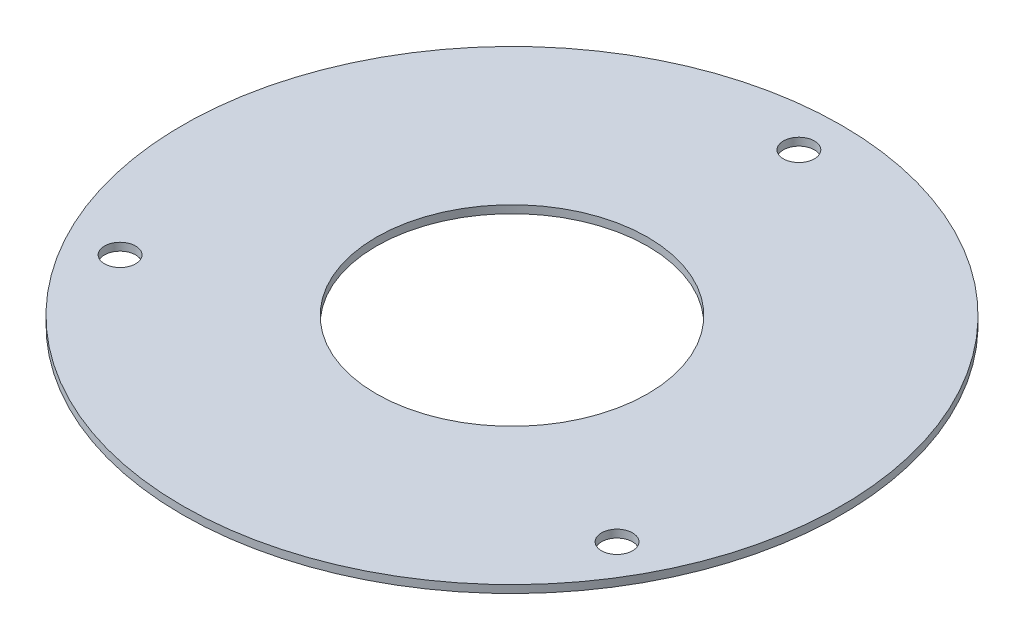
ISO-10303-21;
HEADER;
FILE_DESCRIPTION(('STEP AP214'),'2;1');
FILE_NAME('part.step','',(''),(''),'','','');
FILE_SCHEMA(('AUTOMOTIVE_DESIGN { 1 0 10303 214 1 1 1 1 }'));
ENDSEC;
DATA;
#1=APPLICATION_CONTEXT('core data for automotive mechanical design processes');
#2=APPLICATION_PROTOCOL_DEFINITION('international standard','automotive_design',2000,#1);
#3=PRODUCT_CONTEXT('',#1,'mechanical');
#4=PRODUCT('Part','Part','',(#3));
#5=PRODUCT_RELATED_PRODUCT_CATEGORY('part','',(#4));
#6=PRODUCT_DEFINITION_FORMATION('','',#4);
#7=PRODUCT_DEFINITION_CONTEXT('part definition',#1,'design');
#8=PRODUCT_DEFINITION('design','',#6,#7);
#9=PRODUCT_DEFINITION_SHAPE('','',#8);
#10=(LENGTH_UNIT() NAMED_UNIT(*) SI_UNIT(.MILLI.,.METRE.));
#11=(NAMED_UNIT(*) PLANE_ANGLE_UNIT() SI_UNIT($,.RADIAN.));
#12=(NAMED_UNIT(*) SI_UNIT($,.STERADIAN.) SOLID_ANGLE_UNIT());
#13=UNCERTAINTY_MEASURE_WITH_UNIT(LENGTH_MEASURE(1.E-05),#10,'distance_accuracy_value','');
#14=(GEOMETRIC_REPRESENTATION_CONTEXT(3) GLOBAL_UNCERTAINTY_ASSIGNED_CONTEXT((#13)) GLOBAL_UNIT_ASSIGNED_CONTEXT((#10,
#11,#12)) REPRESENTATION_CONTEXT('',''));
#15=CARTESIAN_POINT('',(0.,0.,0.));
#16=DIRECTION('',(0.,0.,1.));
#17=DIRECTION('',(1.,0.,0.));
#18=AXIS2_PLACEMENT_3D('',#15,#16,#17);
#19=CARTESIAN_POINT('',(0.,1.,0.));
#20=DIRECTION('',(0.,1.,0.));
#21=DIRECTION('',(0.,0.,1.));
#22=AXIS2_PLACEMENT_3D('',#19,#20,#21);
#23=PLANE('',#22);
#24=CARTESIAN_POINT('',(32.0429399400266,1.,18.4999999999986));
#25=DIRECTION('',(0.,1.,0.));
#26=DIRECTION('',(0.,0.,1.));
#27=AXIS2_PLACEMENT_3D('',#24,#25,#26);
#28=CIRCLE('',#27,2.00000000000204);
#29=CARTESIAN_POINT('',(32.0429399400266,1.,20.5000000000007));
#30=VERTEX_POINT('',#29);
#31=EDGE_CURVE('E54',#30,#30,#28,.T.);
#32=ORIENTED_EDGE('',*,*,#31,.F.);
#33=EDGE_LOOP('',(#32));
#34=FACE_BOUND('',#33,.T.);
#35=CARTESIAN_POINT('',(0.,1.,0.));
#36=DIRECTION('',(0.,1.,0.));
#37=DIRECTION('',(0.,0.,1.));
#38=AXIS2_PLACEMENT_3D('',#35,#36,#37);
#39=CIRCLE('',#38,17.5);
#40=CARTESIAN_POINT('',(0.,1.,17.5));
#41=VERTEX_POINT('',#40);
#42=EDGE_CURVE('E43',#41,#41,#39,.T.);
#43=ORIENTED_EDGE('',*,*,#42,.F.);
#44=EDGE_LOOP('',(#43));
#45=FACE_BOUND('',#44,.T.);
#46=CARTESIAN_POINT('',(0.,1.,0.));
#47=DIRECTION('',(0.,1.,0.));
#48=DIRECTION('',(0.,0.,1.));
#49=AXIS2_PLACEMENT_3D('',#46,#47,#48);
#50=CIRCLE('',#49,42.5);
#51=CARTESIAN_POINT('',(0.,1.,42.5));
#52=VERTEX_POINT('',#51);
#53=EDGE_CURVE('E10',#52,#52,#50,.T.);
#54=ORIENTED_EDGE('',*,*,#53,.T.);
#55=EDGE_LOOP('',(#54));
#56=FACE_BOUND('',#55,.T.);
#57=CARTESIAN_POINT('',(0.,1.,-37.));
#58=DIRECTION('',(0.,1.,0.));
#59=DIRECTION('',(0.,0.,1.));
#60=AXIS2_PLACEMENT_3D('',#57,#58,#59);
#61=CIRCLE('',#60,2.);
#62=CARTESIAN_POINT('',(0.,1.,-35.));
#63=VERTEX_POINT('',#62);
#64=EDGE_CURVE('E48',#63,#63,#61,.T.);
#65=ORIENTED_EDGE('',*,*,#64,.F.);
#66=EDGE_LOOP('',(#65));
#67=FACE_BOUND('',#66,.T.);
#68=CARTESIAN_POINT('',(-32.0429399400219,1.,18.5000000000014));
#69=DIRECTION('',(0.,1.,0.));
#70=DIRECTION('',(0.,0.,1.));
#71=AXIS2_PLACEMENT_3D('',#68,#69,#70);
#72=CIRCLE('',#71,2.00000000000301);
#73=CARTESIAN_POINT('',(-32.0429399400219,1.,20.5000000000044));
#74=VERTEX_POINT('',#73);
#75=EDGE_CURVE('E60',#74,#74,#72,.T.);
#76=ORIENTED_EDGE('',*,*,#75,.F.);
#77=EDGE_LOOP('',(#76));
#78=FACE_BOUND('',#77,.T.);
#79=ADVANCED_FACE('F32',(#34,#45,#56,#67,#78),#23,.T.);
#80=CARTESIAN_POINT('',(0.,0.,0.));
#81=DIRECTION('',(0.,1.,0.));
#82=DIRECTION('',(0.,0.,1.));
#83=AXIS2_PLACEMENT_3D('',#80,#81,#82);
#84=PLANE('',#83);
#85=CARTESIAN_POINT('',(32.0429399400266,0.,18.4999999999986));
#86=DIRECTION('',(0.,1.,0.));
#87=DIRECTION('',(0.,0.,1.));
#88=AXIS2_PLACEMENT_3D('',#85,#86,#87);
#89=CIRCLE('',#88,2.00000000000204);
#90=CARTESIAN_POINT('',(32.0429399400266,0.,20.5000000000007));
#91=VERTEX_POINT('',#90);
#92=EDGE_CURVE('E57',#91,#91,#89,.T.);
#93=ORIENTED_EDGE('',*,*,#92,.T.);
#94=EDGE_LOOP('',(#93));
#95=FACE_BOUND('',#94,.T.);
#96=CARTESIAN_POINT('',(0.,0.,0.));
#97=DIRECTION('',(0.,1.,0.));
#98=DIRECTION('',(0.,0.,1.));
#99=AXIS2_PLACEMENT_3D('',#96,#97,#98);
#100=CIRCLE('',#99,17.5);
#101=CARTESIAN_POINT('',(0.,0.,17.5));
#102=VERTEX_POINT('',#101);
#103=EDGE_CURVE('E45',#102,#102,#100,.T.);
#104=ORIENTED_EDGE('',*,*,#103,.T.);
#105=EDGE_LOOP('',(#104));
#106=FACE_BOUND('',#105,.T.);
#107=CARTESIAN_POINT('',(0.,0.,0.));
#108=DIRECTION('',(0.,1.,0.));
#109=DIRECTION('',(0.,0.,1.));
#110=AXIS2_PLACEMENT_3D('',#107,#108,#109);
#111=CIRCLE('',#110,42.5);
#112=CARTESIAN_POINT('',(0.,0.,42.5));
#113=VERTEX_POINT('',#112);
#114=EDGE_CURVE('E36',#113,#113,#111,.T.);
#115=ORIENTED_EDGE('',*,*,#114,.F.);
#116=EDGE_LOOP('',(#115));
#117=FACE_BOUND('',#116,.T.);
#118=CARTESIAN_POINT('',(0.,0.,-37.));
#119=DIRECTION('',(0.,1.,0.));
#120=DIRECTION('',(0.,0.,1.));
#121=AXIS2_PLACEMENT_3D('',#118,#119,#120);
#122=CIRCLE('',#121,2.);
#123=CARTESIAN_POINT('',(0.,0.,-35.));
#124=VERTEX_POINT('',#123);
#125=EDGE_CURVE('E51',#124,#124,#122,.T.);
#126=ORIENTED_EDGE('',*,*,#125,.T.);
#127=EDGE_LOOP('',(#126));
#128=FACE_BOUND('',#127,.T.);
#129=CARTESIAN_POINT('',(-32.0429399400219,0.,18.5000000000014));
#130=DIRECTION('',(0.,1.,0.));
#131=DIRECTION('',(0.,0.,1.));
#132=AXIS2_PLACEMENT_3D('',#129,#130,#131);
#133=CIRCLE('',#132,2.00000000000301);
#134=CARTESIAN_POINT('',(-32.0429399400219,0.,20.5000000000044));
#135=VERTEX_POINT('',#134);
#136=EDGE_CURVE('E63',#135,#135,#133,.T.);
#137=ORIENTED_EDGE('',*,*,#136,.T.);
#138=EDGE_LOOP('',(#137));
#139=FACE_BOUND('',#138,.T.);
#140=ADVANCED_FACE('F73',(#95,#106,#117,#128,#139),#84,.F.);
#141=CARTESIAN_POINT('',(0.,1.,0.));
#142=DIRECTION('',(0.,-1.,0.));
#143=DIRECTION('',(0.,0.,-1.));
#144=AXIS2_PLACEMENT_3D('',#141,#142,#143);
#145=CYLINDRICAL_SURFACE('',#144,42.5);
#146=ORIENTED_EDGE('',*,*,#53,.F.);
#147=EDGE_LOOP('',(#146));
#148=FACE_BOUND('',#147,.T.);
#149=ORIENTED_EDGE('',*,*,#114,.T.);
#150=EDGE_LOOP('',(#149));
#151=FACE_BOUND('',#150,.T.);
#152=ADVANCED_FACE('F34',(#148,#151),#145,.T.);
#153=CARTESIAN_POINT('',(0.,1.,0.));
#154=DIRECTION('',(0.,-1.,0.));
#155=DIRECTION('',(0.,0.,-1.));
#156=AXIS2_PLACEMENT_3D('',#153,#154,#155);
#157=CYLINDRICAL_SURFACE('',#156,17.5);
#158=ORIENTED_EDGE('',*,*,#42,.T.);
#159=EDGE_LOOP('',(#158));
#160=FACE_BOUND('',#159,.T.);
#161=ORIENTED_EDGE('',*,*,#103,.F.);
#162=EDGE_LOOP('',(#161));
#163=FACE_BOUND('',#162,.T.);
#164=ADVANCED_FACE('F83',(#160,#163),#157,.F.);
#165=CARTESIAN_POINT('',(0.,1.,-37.));
#166=DIRECTION('',(0.,-1.,0.));
#167=DIRECTION('',(0.,0.,-1.));
#168=AXIS2_PLACEMENT_3D('',#165,#166,#167);
#169=CYLINDRICAL_SURFACE('',#168,2.);
#170=ORIENTED_EDGE('',*,*,#64,.T.);
#171=EDGE_LOOP('',(#170));
#172=FACE_BOUND('',#171,.T.);
#173=ORIENTED_EDGE('',*,*,#125,.F.);
#174=EDGE_LOOP('',(#173));
#175=FACE_BOUND('',#174,.T.);
#176=ADVANCED_FACE('F86',(#172,#175),#169,.F.);
#177=CARTESIAN_POINT('',(32.0429399400266,1.,18.4999999999986));
#178=DIRECTION('',(0.,-1.,0.));
#179=DIRECTION('',(0.,0.,-1.));
#180=AXIS2_PLACEMENT_3D('',#177,#178,#179);
#181=CYLINDRICAL_SURFACE('',#180,2.00000000000204);
#182=ORIENTED_EDGE('',*,*,#31,.T.);
#183=EDGE_LOOP('',(#182));
#184=FACE_BOUND('',#183,.T.);
#185=ORIENTED_EDGE('',*,*,#92,.F.);
#186=EDGE_LOOP('',(#185));
#187=FACE_BOUND('',#186,.T.);
#188=ADVANCED_FACE('F90',(#184,#187),#181,.F.);
#189=CARTESIAN_POINT('',(-32.0429399400219,1.,18.5000000000014));
#190=DIRECTION('',(0.,-1.,0.));
#191=DIRECTION('',(0.,0.,-1.));
#192=AXIS2_PLACEMENT_3D('',#189,#190,#191);
#193=CYLINDRICAL_SURFACE('',#192,2.00000000000301);
#194=ORIENTED_EDGE('',*,*,#75,.T.);
#195=EDGE_LOOP('',(#194));
#196=FACE_BOUND('',#195,.T.);
#197=ORIENTED_EDGE('',*,*,#136,.F.);
#198=EDGE_LOOP('',(#197));
#199=FACE_BOUND('',#198,.T.);
#200=ADVANCED_FACE('F69',(#196,#199),#193,.F.);
#201=CLOSED_SHELL('',(#79,#140,#152,#164,#176,#188,#200));
#202=MANIFOLD_SOLID_BREP('B2',#201);
#203=ADVANCED_BREP_SHAPE_REPRESENTATION('',(#18,#202),#14);
#204=SHAPE_DEFINITION_REPRESENTATION(#9,#203);
ENDSEC;
END-ISO-10303-21;
